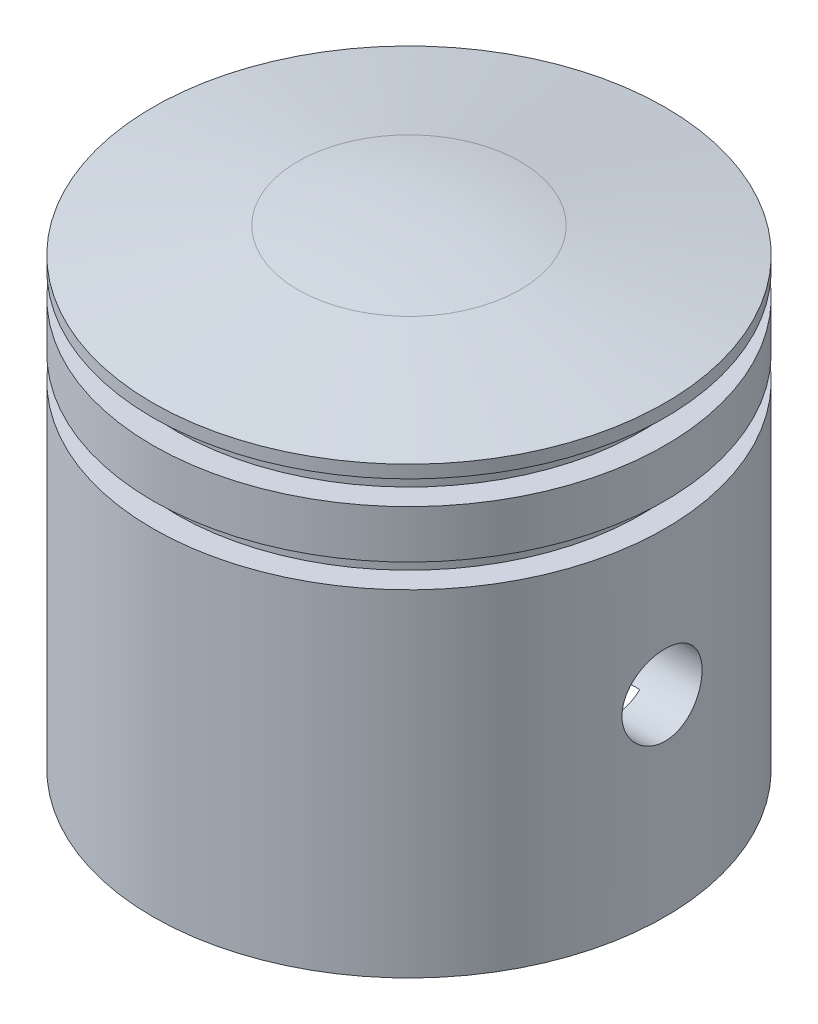
ISO-10303-21;
HEADER;
FILE_DESCRIPTION(('STEP AP214'),'2;1');
FILE_NAME('part.step','',(''),(''),'','','');
FILE_SCHEMA(('AUTOMOTIVE_DESIGN { 1 0 10303 214 1 1 1 1 }'));
ENDSEC;
DATA;
#1=APPLICATION_CONTEXT('core data for automotive mechanical design processes');
#2=APPLICATION_PROTOCOL_DEFINITION('international standard','automotive_design',2000,#1);
#3=PRODUCT_CONTEXT('',#1,'mechanical');
#4=PRODUCT('Part','Part','',(#3));
#5=PRODUCT_RELATED_PRODUCT_CATEGORY('part','',(#4));
#6=PRODUCT_DEFINITION_FORMATION('','',#4);
#7=PRODUCT_DEFINITION_CONTEXT('part definition',#1,'design');
#8=PRODUCT_DEFINITION('design','',#6,#7);
#9=PRODUCT_DEFINITION_SHAPE('','',#8);
#10=(LENGTH_UNIT() NAMED_UNIT(*) SI_UNIT(.MILLI.,.METRE.));
#11=(NAMED_UNIT(*) PLANE_ANGLE_UNIT() SI_UNIT($,.RADIAN.));
#12=(NAMED_UNIT(*) SI_UNIT($,.STERADIAN.) SOLID_ANGLE_UNIT());
#13=UNCERTAINTY_MEASURE_WITH_UNIT(LENGTH_MEASURE(1.E-05),#10,'distance_accuracy_value','');
#14=(GEOMETRIC_REPRESENTATION_CONTEXT(3) GLOBAL_UNCERTAINTY_ASSIGNED_CONTEXT((#13)) GLOBAL_UNIT_ASSIGNED_CONTEXT((#10,
#11,#12)) REPRESENTATION_CONTEXT('',''));
#15=CARTESIAN_POINT('',(0.,0.,0.));
#16=DIRECTION('',(0.,0.,1.));
#17=DIRECTION('',(1.,0.,0.));
#18=AXIS2_PLACEMENT_3D('',#15,#16,#17);
#19=CARTESIAN_POINT('',(0.,10.,0.));
#20=DIRECTION('',(0.,-1.,0.));
#21=DIRECTION('',(0.,0.,-1.));
#22=AXIS2_PLACEMENT_3D('',#19,#20,#21);
#23=PLANE('',#22);
#24=DIRECTION('',(1.,0.,0.));
#25=VECTOR('',#24,1.);
#26=CARTESIAN_POINT('',(-16.,10.,-1.5));
#27=LINE('',#26,#25);
#28=CARTESIAN_POINT('',(-12.913171570145,10.,-1.5));
#29=VERTEX_POINT('',#28);
#30=CARTESIAN_POINT('',(-9.88685996664259,10.,-1.5));
#31=VERTEX_POINT('',#30);
#32=EDGE_CURVE('E75',#29,#31,#27,.T.);
#33=ORIENTED_EDGE('',*,*,#32,.F.);
#34=CARTESIAN_POINT('',(0.,10.,0.));
#35=DIRECTION('',(0.,-1.,0.));
#36=DIRECTION('',(0.,0.,-1.));
#37=AXIS2_PLACEMENT_3D('',#34,#35,#36);
#38=CIRCLE('',#37,13.);
#39=CARTESIAN_POINT('',(12.913171570145,10.,-1.5));
#40=VERTEX_POINT('',#39);
#41=EDGE_CURVE('E262',#29,#40,#38,.T.);
#42=ORIENTED_EDGE('',*,*,#41,.T.);
#43=CARTESIAN_POINT('',(9.88685996664259,10.,-1.5));
#44=VERTEX_POINT('',#43);
#45=EDGE_CURVE('E266',#44,#40,#27,.T.);
#46=ORIENTED_EDGE('',*,*,#45,.F.);
#47=CARTESIAN_POINT('',(0.,10.,0.));
#48=DIRECTION('',(0.,-1.,0.));
#49=DIRECTION('',(0.,0.,-1.));
#50=AXIS2_PLACEMENT_3D('',#47,#48,#49);
#51=CIRCLE('',#50,10.);
#52=EDGE_CURVE('E110',#44,#31,#51,.F.);
#53=ORIENTED_EDGE('',*,*,#52,.T.);
#54=EDGE_LOOP('',(#33,#42,#46,#53));
#55=FACE_BOUND('',#54,.T.);
#56=ADVANCED_FACE('F47',(#55),#23,.T.);
#57=CARTESIAN_POINT('',(0.,30.,0.));
#58=DIRECTION('',(0.,1.,0.));
#59=DIRECTION('',(0.,0.,1.));
#60=AXIS2_PLACEMENT_3D('',#57,#58,#59);
#61=CYLINDRICAL_SURFACE('',#60,16.);
#62=CARTESIAN_POINT('',(0.,27.,0.));
#63=DIRECTION('',(0.,1.,0.));
#64=DIRECTION('',(0.,0.,1.));
#65=AXIS2_PLACEMENT_3D('',#62,#63,#64);
#66=CIRCLE('',#65,16.);
#67=CARTESIAN_POINT('',(0.,27.,16.));
#68=VERTEX_POINT('',#67);
#69=EDGE_CURVE('E237',#68,#68,#66,.T.);
#70=ORIENTED_EDGE('',*,*,#69,.T.);
#71=EDGE_LOOP('',(#70));
#72=FACE_BOUND('',#71,.T.);
#73=CARTESIAN_POINT('',(0.,27.7958327840944,0.));
#74=DIRECTION('',(0.,1.,0.));
#75=DIRECTION('',(0.,0.,1.));
#76=AXIS2_PLACEMENT_3D('',#73,#74,#75);
#77=CIRCLE('',#76,16.);
#78=CARTESIAN_POINT('',(0.,27.7958327840944,16.));
#79=VERTEX_POINT('',#78);
#80=EDGE_CURVE('E248',#79,#79,#77,.T.);
#81=ORIENTED_EDGE('',*,*,#80,.F.);
#82=EDGE_LOOP('',(#81));
#83=FACE_BOUND('',#82,.T.);
#84=ADVANCED_FACE('F160',(#72,#83),#61,.T.);
#85=CARTESIAN_POINT('',(0.,27.7958327840944,0.));
#86=DIRECTION('',(0.,-1.,0.));
#87=DIRECTION('',(0.,0.,-1.));
#88=AXIS2_PLACEMENT_3D('',#85,#86,#87);
#89=CONICAL_SURFACE('',#88,16.,1.39626340159547);
#90=CARTESIAN_POINT('',(0.,29.3923101204884,0.));
#91=DIRECTION('',(0.,1.,0.));
#92=DIRECTION('',(0.,0.,1.));
#93=AXIS2_PLACEMENT_3D('',#90,#91,#92);
#94=CIRCLE('',#93,6.94592710667694);
#95=CARTESIAN_POINT('',(0.,29.3923101204884,6.94592710667694));
#96=VERTEX_POINT('',#95);
#97=EDGE_CURVE('E246',#96,#96,#94,.T.);
#98=ORIENTED_EDGE('',*,*,#97,.F.);
#99=EDGE_LOOP('',(#98));
#100=FACE_BOUND('',#99,.T.);
#101=ORIENTED_EDGE('',*,*,#80,.T.);
#102=EDGE_LOOP('',(#101));
#103=FACE_BOUND('',#102,.T.);
#104=ADVANCED_FACE('F164',(#100,#103),#89,.T.);
#105=CARTESIAN_POINT('',(0.,-10.,0.));
#106=DIRECTION('',(0.,1.,0.));
#107=DIRECTION('',(1.,0.,0.));
#108=AXIS2_PLACEMENT_3D('',#105,#106,#107);
#109=SPHERICAL_SURFACE('',#108,40.);
#110=ORIENTED_EDGE('',*,*,#97,.T.);
#111=EDGE_LOOP('',(#110));
#112=FACE_BOUND('',#111,.T.);
#113=ADVANCED_FACE('F171',(#112),#109,.T.);
#114=CARTESIAN_POINT('',(0.,25.5,-14.5));
#115=DIRECTION('',(0.,-1.,0.));
#116=DIRECTION('',(0.,0.,-1.));
#117=AXIS2_PLACEMENT_3D('',#114,#115,#116);
#118=PLANE('',#117);
#119=CARTESIAN_POINT('',(0.,25.5,0.));
#120=DIRECTION('',(0.,-1.,0.));
#121=DIRECTION('',(0.,0.,-1.));
#122=AXIS2_PLACEMENT_3D('',#119,#120,#121);
#123=CIRCLE('',#122,14.5);
#124=CARTESIAN_POINT('',(0.,25.5,-14.5));
#125=VERTEX_POINT('',#124);
#126=EDGE_CURVE('E234',#125,#125,#123,.T.);
#127=ORIENTED_EDGE('',*,*,#126,.T.);
#128=EDGE_LOOP('',(#127));
#129=FACE_BOUND('',#128,.T.);
#130=CARTESIAN_POINT('',(0.,25.5,0.));
#131=DIRECTION('',(0.,-1.,0.));
#132=DIRECTION('',(0.,0.,-1.));
#133=AXIS2_PLACEMENT_3D('',#130,#131,#132);
#134=CIRCLE('',#133,16.);
#135=CARTESIAN_POINT('',(0.,25.5,-16.));
#136=VERTEX_POINT('',#135);
#137=EDGE_CURVE('E116',#136,#136,#134,.T.);
#138=ORIENTED_EDGE('',*,*,#137,.F.);
#139=EDGE_LOOP('',(#138));
#140=FACE_BOUND('',#139,.T.);
#141=ADVANCED_FACE('F175',(#129,#140),#118,.F.);
#142=CARTESIAN_POINT('',(0.,27.,-14.5));
#143=DIRECTION('',(0.,1.,0.));
#144=DIRECTION('',(0.,0.,1.));
#145=AXIS2_PLACEMENT_3D('',#142,#143,#144);
#146=PLANE('',#145);
#147=CARTESIAN_POINT('',(0.,27.,0.));
#148=DIRECTION('',(0.,-1.,0.));
#149=DIRECTION('',(0.,0.,-1.));
#150=AXIS2_PLACEMENT_3D('',#147,#148,#149);
#151=CIRCLE('',#150,14.5);
#152=CARTESIAN_POINT('',(0.,27.,-14.5));
#153=VERTEX_POINT('',#152);
#154=EDGE_CURVE('E240',#153,#153,#151,.T.);
#155=ORIENTED_EDGE('',*,*,#154,.F.);
#156=EDGE_LOOP('',(#155));
#157=FACE_BOUND('',#156,.T.);
#158=ORIENTED_EDGE('',*,*,#69,.F.);
#159=EDGE_LOOP('',(#158));
#160=FACE_BOUND('',#159,.T.);
#161=ADVANCED_FACE('F192',(#157,#160),#146,.F.);
#162=CARTESIAN_POINT('',(0.,0.,0.));
#163=DIRECTION('',(0.,-1.,0.));
#164=DIRECTION('',(0.,0.,-1.));
#165=AXIS2_PLACEMENT_3D('',#162,#163,#164);
#166=CYLINDRICAL_SURFACE('',#165,14.5);
#167=ORIENTED_EDGE('',*,*,#126,.F.);
#168=EDGE_LOOP('',(#167));
#169=FACE_BOUND('',#168,.T.);
#170=ORIENTED_EDGE('',*,*,#154,.T.);
#171=EDGE_LOOP('',(#170));
#172=FACE_BOUND('',#171,.T.);
#173=ADVANCED_FACE('F189',(#169,#172),#166,.T.);
#174=ORIENTED_EDGE('',*,*,#137,.T.);
#175=EDGE_LOOP('',(#174));
#176=FACE_BOUND('',#175,.T.);
#177=CARTESIAN_POINT('',(0.,22.5,0.));
#178=DIRECTION('',(0.,1.,0.));
#179=DIRECTION('',(0.,0.,1.));
#180=AXIS2_PLACEMENT_3D('',#177,#178,#179);
#181=CIRCLE('',#180,16.);
#182=CARTESIAN_POINT('',(0.,22.5,16.));
#183=VERTEX_POINT('',#182);
#184=EDGE_CURVE('E231',#183,#183,#181,.T.);
#185=ORIENTED_EDGE('',*,*,#184,.T.);
#186=EDGE_LOOP('',(#185));
#187=FACE_BOUND('',#186,.T.);
#188=ADVANCED_FACE('F166',(#176,#187),#61,.T.);
#189=CARTESIAN_POINT('',(0.,21.,-14.5));
#190=DIRECTION('',(0.,-1.,0.));
#191=DIRECTION('',(0.,0.,-1.));
#192=AXIS2_PLACEMENT_3D('',#189,#190,#191);
#193=PLANE('',#192);
#194=CARTESIAN_POINT('',(0.,21.,0.));
#195=DIRECTION('',(0.,-1.,0.));
#196=DIRECTION('',(0.,0.,-1.));
#197=AXIS2_PLACEMENT_3D('',#194,#195,#196);
#198=CIRCLE('',#197,14.5);
#199=CARTESIAN_POINT('',(0.,21.,-14.5));
#200=VERTEX_POINT('',#199);
#201=EDGE_CURVE('E253',#200,#200,#198,.T.);
#202=ORIENTED_EDGE('',*,*,#201,.T.);
#203=EDGE_LOOP('',(#202));
#204=FACE_BOUND('',#203,.T.);
#205=CARTESIAN_POINT('',(0.,21.,0.));
#206=DIRECTION('',(0.,-1.,0.));
#207=DIRECTION('',(0.,0.,-1.));
#208=AXIS2_PLACEMENT_3D('',#205,#206,#207);
#209=CIRCLE('',#208,16.);
#210=CARTESIAN_POINT('',(0.,21.,-16.));
#211=VERTEX_POINT('',#210);
#212=EDGE_CURVE('E233',#211,#211,#209,.T.);
#213=ORIENTED_EDGE('',*,*,#212,.F.);
#214=EDGE_LOOP('',(#213));
#215=FACE_BOUND('',#214,.T.);
#216=ADVANCED_FACE('F182',(#204,#215),#193,.F.);
#217=CARTESIAN_POINT('',(0.,22.5,-14.5));
#218=DIRECTION('',(0.,1.,0.));
#219=DIRECTION('',(0.,0.,1.));
#220=AXIS2_PLACEMENT_3D('',#217,#218,#219);
#221=PLANE('',#220);
#222=CARTESIAN_POINT('',(0.,22.5,0.));
#223=DIRECTION('',(0.,-1.,0.));
#224=DIRECTION('',(0.,0.,-1.));
#225=AXIS2_PLACEMENT_3D('',#222,#223,#224);
#226=CIRCLE('',#225,14.5);
#227=CARTESIAN_POINT('',(0.,22.5,-14.5));
#228=VERTEX_POINT('',#227);
#229=EDGE_CURVE('E113',#228,#228,#226,.T.);
#230=ORIENTED_EDGE('',*,*,#229,.F.);
#231=EDGE_LOOP('',(#230));
#232=FACE_BOUND('',#231,.T.);
#233=ORIENTED_EDGE('',*,*,#184,.F.);
#234=EDGE_LOOP('',(#233));
#235=FACE_BOUND('',#234,.T.);
#236=ADVANCED_FACE('F180',(#232,#235),#221,.F.);
#237=CARTESIAN_POINT('',(0.,0.,0.));
#238=DIRECTION('',(0.,-1.,0.));
#239=DIRECTION('',(0.,0.,-1.));
#240=AXIS2_PLACEMENT_3D('',#237,#238,#239);
#241=CYLINDRICAL_SURFACE('',#240,14.5);
#242=ORIENTED_EDGE('',*,*,#201,.F.);
#243=EDGE_LOOP('',(#242));
#244=FACE_BOUND('',#243,.T.);
#245=ORIENTED_EDGE('',*,*,#229,.T.);
#246=EDGE_LOOP('',(#245));
#247=FACE_BOUND('',#246,.T.);
#248=ADVANCED_FACE('F177',(#244,#247),#241,.T.);
#249=CARTESIAN_POINT('',(0.,0.,0.));
#250=DIRECTION('',(0.,1.,0.));
#251=DIRECTION('',(0.,0.,1.));
#252=AXIS2_PLACEMENT_3D('',#249,#250,#251);
#253=PLANE('',#252);
#254=CARTESIAN_POINT('',(0.,0.,0.));
#255=DIRECTION('',(0.,-1.,0.));
#256=DIRECTION('',(0.,0.,-1.));
#257=AXIS2_PLACEMENT_3D('',#254,#255,#256);
#258=CIRCLE('',#257,13.);
#259=CARTESIAN_POINT('',(0.,0.,-13.));
#260=VERTEX_POINT('',#259);
#261=EDGE_CURVE('E260',#260,#260,#258,.T.);
#262=ORIENTED_EDGE('',*,*,#261,.F.);
#263=EDGE_LOOP('',(#262));
#264=FACE_BOUND('',#263,.T.);
#265=CARTESIAN_POINT('',(0.,0.,0.));
#266=DIRECTION('',(0.,1.,0.));
#267=DIRECTION('',(0.,0.,1.));
#268=AXIS2_PLACEMENT_3D('',#265,#266,#267);
#269=CIRCLE('',#268,16.);
#270=CARTESIAN_POINT('',(0.,0.,16.));
#271=VERTEX_POINT('',#270);
#272=EDGE_CURVE('E99',#271,#271,#269,.T.);
#273=ORIENTED_EDGE('',*,*,#272,.F.);
#274=EDGE_LOOP('',(#273));
#275=FACE_BOUND('',#274,.T.);
#276=ADVANCED_FACE('F49',(#264,#275),#253,.F.);
#277=CARTESIAN_POINT('',(-16.,14.5,0.));
#278=CARTESIAN_POINT('',(-15.9999977019448,14.4999943017285,0.139515097271033));
#279=CARTESIAN_POINT('',(-15.9981561248574,14.4882818862264,0.279109404865704));
#280=CARTESIAN_POINT('',(-15.9909869809759,14.4417563087232,0.554391314978102));
#281=CARTESIAN_POINT('',(-15.9856560884472,14.4069211074965,0.690075061323317));
#282=CARTESIAN_POINT('',(-15.9721069716578,14.3152203371934,0.953512538047404));
#283=CARTESIAN_POINT('',(-15.9638909956317,14.2583719186384,1.0812723522899));
#284=CARTESIAN_POINT('',(-15.9454779403816,14.1243014548584,1.3254212510446));
#285=CARTESIAN_POINT('',(-15.9352811186255,14.0470820569641,1.44181181036831));
#286=CARTESIAN_POINT('',(-15.9139426841436,13.873766951646,1.66091991165162));
#287=CARTESIAN_POINT('',(-15.9027945139234,13.7775330051098,1.76352747914264));
#288=CARTESIAN_POINT('',(-15.8808607613029,13.5692180517311,1.95120768822823));
#289=CARTESIAN_POINT('',(-15.8700752005075,13.4571361026998,2.03627928654192));
#290=CARTESIAN_POINT('',(-15.8500242812745,13.2195617286563,2.18690544328884));
#291=CARTESIAN_POINT('',(-15.840767397861,13.0940005176382,2.25235273557992));
#292=CARTESIAN_POINT('',(-15.8249120174237,12.8334985891422,2.36118681597065));
#293=CARTESIAN_POINT('',(-15.8183133630222,12.6985584274894,2.40457491010063));
#294=CARTESIAN_POINT('',(-15.8085863451104,12.4242890988562,2.46771559322167));
#295=CARTESIAN_POINT('',(-15.8054302653236,12.2850044141812,2.48765705487496));
#296=CARTESIAN_POINT('',(-15.8028617107177,12.0050328111074,2.50392369757622));
#297=CARTESIAN_POINT('',(-15.8034490028802,11.864345980534,2.50025034860466));
#298=CARTESIAN_POINT('',(-15.8082755045521,11.5869029681473,2.4695458080889));
#299=CARTESIAN_POINT('',(-15.8124817218495,11.4501227766469,2.44272562959693));
#300=CARTESIAN_POINT('',(-15.8240205634547,11.1830279936407,2.36681937833752));
#301=CARTESIAN_POINT('',(-15.8313532830641,11.0527135993595,2.31773262684132));
#302=CARTESIAN_POINT('',(-15.8483550685462,10.8016112873228,2.19846916949384));
#303=CARTESIAN_POINT('',(-15.8580339308724,10.6808662082269,2.12820372315549));
#304=CARTESIAN_POINT('',(-15.878630461501,10.4528004643145,1.96864058146637));
#305=CARTESIAN_POINT('',(-15.8895482178821,10.3454807551125,1.87934153253017));
#306=CARTESIAN_POINT('',(-15.911537862489,10.1460897533667,1.68309088822333));
#307=CARTESIAN_POINT('',(-15.9226101363559,10.0541968417305,1.57595800560539));
#308=CARTESIAN_POINT('',(-15.9435512534783,9.8896668543601,1.34769694737936));
#309=CARTESIAN_POINT('',(-15.9534200906202,9.81702987644317,1.22656870068132));
#310=CARTESIAN_POINT('',(-15.9708539902704,9.69306192657761,0.973595927056491));
#311=CARTESIAN_POINT('',(-15.9784174854193,9.641745441467,0.84174418624046));
#312=CARTESIAN_POINT('',(-15.9903756000068,9.56203403255277,0.571149534696759));
#313=CARTESIAN_POINT('',(-15.9947704520898,9.53363742593352,0.4324071306872));
#314=CARTESIAN_POINT('',(-15.9998651172728,9.50081072354981,0.153508336763735));
#315=CARTESIAN_POINT('',(-16.0006027179286,9.49613552102382,0.0133814615087023));
#316=CARTESIAN_POINT('',(-15.9984028649127,9.51023270533598,-0.265654546411642));
#317=CARTESIAN_POINT('',(-15.9954655349964,9.52900430258911,-0.404563719925156));
#318=CARTESIAN_POINT('',(-15.9862692369322,9.58925838768018,-0.676473446265705));
#319=CARTESIAN_POINT('',(-15.9800278421539,9.63062075826773,-0.809501262056042));
#320=CARTESIAN_POINT('',(-15.9649207568356,9.73475509439879,-1.06673406785663));
#321=CARTESIAN_POINT('',(-15.9560549341007,9.79752813844267,-1.19093861303941));
#322=CARTESIAN_POINT('',(-15.9365897274094,9.94327199112658,-1.42807220225041));
#323=CARTESIAN_POINT('',(-15.9259772866342,10.0263974200905,-1.54090512378372));
#324=CARTESIAN_POINT('',(-15.9042388046444,10.2102720859078,-1.75110696507806));
#325=CARTESIAN_POINT('',(-15.8931127309268,10.3110224392049,-1.84847490447018));
#326=CARTESIAN_POINT('',(-15.8714802753665,10.5283811972172,-2.02588080776691));
#327=CARTESIAN_POINT('',(-15.860980411908,10.6451248471223,-2.10575398584126));
#328=CARTESIAN_POINT('',(-15.8419069280583,10.8905160736613,-2.2447556772664));
#329=CARTESIAN_POINT('',(-15.83333325222,11.0191633074895,-2.30388478778105));
#330=CARTESIAN_POINT('',(-15.8191307135236,11.2842296407142,-2.39946771944995));
#331=CARTESIAN_POINT('',(-15.8134908234896,11.4206174687656,-2.43600654947912));
#332=CARTESIAN_POINT('',(-15.8057657028079,11.697689143664,-2.48564122040535));
#333=CARTESIAN_POINT('',(-15.8036802038444,11.838372665419,-2.49873883084997));
#334=CARTESIAN_POINT('',(-15.8033105804488,12.1183987159075,-2.50107452690756));
#335=CARTESIAN_POINT('',(-15.804985160429,12.2577390969335,-2.49057180548425));
#336=CARTESIAN_POINT('',(-15.8118569894183,12.5326452971443,-2.44656223255901));
#337=CARTESIAN_POINT('',(-15.8170542307995,12.6682111245017,-2.41305543086961));
#338=CARTESIAN_POINT('',(-15.8303708885491,12.9316378266405,-2.32408329891852));
#339=CARTESIAN_POINT('',(-15.8384876895341,13.0595054782584,-2.26863761738581));
#340=CARTESIAN_POINT('',(-15.856731840474,13.3041656136763,-2.13738768546417));
#341=CARTESIAN_POINT('',(-15.8668592701083,13.4209576582884,-2.06158262820886));
#342=CARTESIAN_POINT('',(-15.8881156809226,13.6414655441268,-1.8908300813908));
#343=CARTESIAN_POINT('',(-15.8992540116029,13.7450321966138,-1.79569107094768));
#344=CARTESIAN_POINT('',(-15.9212004364073,13.9348212363867,-1.58937594638204));
#345=CARTESIAN_POINT('',(-15.9320084534012,14.0210395985919,-1.47819612078432));
#346=CARTESIAN_POINT('',(-15.952151024567,14.1741512230316,-1.24216685884342));
#347=CARTESIAN_POINT('',(-15.9614763443027,14.2409253727596,-1.11723937214238));
#348=CARTESIAN_POINT('',(-15.9775125983888,14.3524409961929,-0.857851882357786));
#349=CARTESIAN_POINT('',(-15.9842262014212,14.3972049725584,-0.723401776581764));
#350=CARTESIAN_POINT('',(-15.9927744586488,14.4534330210906,-0.490314239911595));
#351=CARTESIAN_POINT('',(-15.9954699162612,14.470868490629,-0.393105575651625));
#352=CARTESIAN_POINT('',(-15.9990834869762,14.4941539133791,-0.197277797850582));
#353=CARTESIAN_POINT('',(-16.0000016250796,14.5000040295573,-0.0986587041691187));
#354=CARTESIAN_POINT('',(-16.,14.5,0.));
#355=B_SPLINE_CURVE_WITH_KNOTS('',3,(#277,#278,#279,#280,#281,#282,#283,#284,#285,#286,#287,
#288,#289,#290,#291,#292,#293,#294,#295,#296,#297,#298,#299,#300,#301,#302,#303,#304,#305,#306,
#307,#308,#309,#310,#311,#312,#313,#314,#315,#316,#317,#318,#319,#320,#321,#322,#323,#324,#325,
#326,#327,#328,#329,#330,#331,#332,#333,#334,#335,#336,#337,#338,#339,#340,#341,#342,#343,#344,
#345,#346,#347,#348,#349,#350,#351,#352,#353,#354),.UNSPECIFIED.,.T.,.F.,(4,2,2,2,2,2,2,2,2,2,2,
2,2,2,2,2,2,2,2,2,2,2,2,2,2,2,2,2,2,2,2,2,2,2,2,2,2,2,4),(0.,0.418184740477491,
0.836768642528014,1.25502707944103,1.6732311879203,2.09459568152199,2.51598523645422,
2.93963778605759,3.36326525009238,3.78345631134994,4.20362121670545,4.6199957602258,
5.03638299651051,5.45453977402348,5.87272629892068,6.29545732334367,6.71819049513827,
7.14121043754565,7.56419931829866,7.98280854005915,8.40140366528357,8.81779444756567,
9.23420620742031,9.65388541469672,10.0735912160142,10.4970948024959,10.9205861964898,
11.3424741039513,11.764330162293,12.1815758159869,12.598820566189,13.0156924696662,
13.4325808967135,13.8538201231554,14.275156971423,14.6990230419984,15.1224548565628,
15.4181801635154,15.7139013105871),.UNSPECIFIED.);
#356=CARTESIAN_POINT('',(-16.,14.5,0.));
#357=VERTEX_POINT('',#356);
#358=EDGE_CURVE('E155',#357,#357,#355,.T.);
#359=ORIENTED_EDGE('',*,*,#358,.T.);
#360=EDGE_LOOP('',(#359));
#361=FACE_BOUND('',#360,.T.);
#362=CARTESIAN_POINT('',(15.8034806292791,12.,-2.5));
#363=CARTESIAN_POINT('',(15.8034830346333,11.860496621659,-2.49999429179104));
#364=CARTESIAN_POINT('',(15.8053478026579,11.7209140023147,-2.48828377742084));
#365=CARTESIAN_POINT('',(15.8125997089632,11.4456563709971,-2.44176643645043));
#366=CARTESIAN_POINT('',(15.8179902148259,11.3099852245206,-2.40693752801736));
#367=CARTESIAN_POINT('',(15.8316684916184,11.0465744103556,-2.31525516047132));
#368=CARTESIAN_POINT('',(15.8399539668268,10.9188285521292,-2.25841914921922));
#369=CARTESIAN_POINT('',(15.8584858981599,10.6747031091579,-2.12437791816389));
#370=CARTESIAN_POINT('',(15.8687321022282,10.5583220663405,-2.04717531605122));
#371=CARTESIAN_POINT('',(15.8901303851737,10.3392035148487,-1.87387730110911));
#372=CARTESIAN_POINT('',(15.9012888784461,10.2365789256004,-1.777639886175));
#373=CARTESIAN_POINT('',(15.9231973082665,10.0488657795701,-1.56931080987672));
#374=CARTESIAN_POINT('',(15.9339472216983,9.96377821377571,-1.45721825316848));
#375=CARTESIAN_POINT('',(15.9538946715316,9.81313512295885,-1.21963429185761));
#376=CARTESIAN_POINT('',(15.9630838016344,9.74768399602554,-1.09407592635729));
#377=CARTESIAN_POINT('',(15.978803149105,9.63884204527492,-0.833580171794756));
#378=CARTESIAN_POINT('',(15.9853335186778,9.59544995861733,-0.698643320136811));
#379=CARTESIAN_POINT('',(15.9949542857973,9.53230128104384,-0.424385325448812));
#380=CARTESIAN_POINT('',(15.9980722260505,9.51235535093165,-0.285108760160752));
#381=CARTESIAN_POINT('',(16.0006113098095,9.49607695669663,-0.00515314355067114));
#382=CARTESIAN_POINT('',(16.0000326754547,9.49974307364815,0.135525822989186));
#383=CARTESIAN_POINT('',(15.9952657389869,9.53043592627786,0.413000089722151));
#384=CARTESIAN_POINT('',(15.9911089169598,9.55725893884032,0.549818542575174));
#385=CARTESIAN_POINT('',(15.9796877395528,9.63318402862262,0.816988375343491));
#386=CARTESIAN_POINT('',(15.9724232987387,9.68228671835413,0.947339577352174));
#387=CARTESIAN_POINT('',(15.9555491842028,9.80158365586005,1.19848742679247));
#388=CARTESIAN_POINT('',(15.9459300777042,9.87186300542795,1.31924299071837));
#389=CARTESIAN_POINT('',(15.9254174702046,10.0314560806292,1.54732385653213));
#390=CARTESIAN_POINT('',(15.9145238783282,10.120771163955,1.65464819959324));
#391=CARTESIAN_POINT('',(15.8925387825556,10.3170334870733,1.85402198520023));
#392=CARTESIAN_POINT('',(15.8814464071021,10.4241586663949,1.94589625613075));
#393=CARTESIAN_POINT('',(15.8604269384475,10.6523975646821,2.11039226047485));
#394=CARTESIAN_POINT('',(15.8504998536298,10.7735113842741,2.18301385538335));
#395=CARTESIAN_POINT('',(15.8329349281613,11.0264796281058,2.30697060635685));
#396=CARTESIAN_POINT('',(15.8252991458489,11.1583435750735,2.35828663884161));
#397=CARTESIAN_POINT('',(15.8132168990948,11.4289648487055,2.43799343127668));
#398=CARTESIAN_POINT('',(15.8087701897074,11.5677216450697,2.46638595195258));
#399=CARTESIAN_POINT('',(15.8036163696886,11.8466281032752,2.49919719237856));
#400=CARTESIAN_POINT('',(15.80287044806,11.9867478001948,2.50386473411271));
#401=CARTESIAN_POINT('',(15.8050994977182,12.2657676352979,2.48975479033184));
#402=CARTESIAN_POINT('',(15.8080743433524,12.4046678145059,2.47097809654328));
#403=CARTESIAN_POINT('',(15.8173740105186,12.6765278074665,2.41072412555896));
#404=CARTESIAN_POINT('',(15.8236803883335,12.8095159986396,2.36937178781979));
#405=CARTESIAN_POINT('',(15.8389172439685,13.0666739711039,2.26527072241932));
#406=CARTESIAN_POINT('',(15.8478478614411,13.190843282649,2.20252085602949));
#407=CARTESIAN_POINT('',(15.8674179220711,13.4279512816488,2.05681199170293));
#408=CARTESIAN_POINT('',(15.8780706945976,13.5407902289,1.97369251093471));
#409=CARTESIAN_POINT('',(15.8998450469621,13.7510069808482,1.78982593995283));
#410=CARTESIAN_POINT('',(15.9109666556111,13.848383833607,1.6890777652142));
#411=CARTESIAN_POINT('',(15.9325473887455,14.0258112706355,1.47171546765808));
#412=CARTESIAN_POINT('',(15.9429995842164,14.1056965764301,1.35496564158984));
#413=CARTESIAN_POINT('',(15.9619548934084,14.2447195199902,1.10955861029337));
#414=CARTESIAN_POINT('',(15.9704580640831,14.3038577640459,0.980901753162492));
#415=CARTESIAN_POINT('',(15.9845269767683,14.3994462752842,0.715839663778327));
#416=CARTESIAN_POINT('',(15.9901042225572,14.4359854974394,0.579467147617089));
#417=CARTESIAN_POINT('',(15.9977412978946,14.4856261326728,0.302427949770746));
#418=CARTESIAN_POINT('',(15.9998013804089,14.498729231356,0.161761577654431));
#419=CARTESIAN_POINT('',(16.0001691012796,14.5010818526552,-0.118272165188271));
#420=CARTESIAN_POINT('',(15.9985164403994,14.4905837446428,-0.257637428859786));
#421=CARTESIAN_POINT('',(15.9917247801431,14.4465746838196,-0.532594595464882));
#422=CARTESIAN_POINT('',(15.9865857947973,14.4130638236216,-0.668186513581641));
#423=CARTESIAN_POINT('',(15.9733964142131,14.3240727402876,-0.931668850429401));
#424=CARTESIAN_POINT('',(15.965348528289,14.2686114484191,-1.05956579651625));
#425=CARTESIAN_POINT('',(15.947223323121,14.137321161478,-1.30427807253219));
#426=CARTESIAN_POINT('',(15.9371459268214,14.0614913930258,-1.42109298145458));
#427=CARTESIAN_POINT('',(15.9159528222148,13.8907105567916,-1.64160219185804));
#428=CARTESIAN_POINT('',(15.9048276353277,13.795573685696,-1.745151694824));
#429=CARTESIAN_POINT('',(15.8828612878644,13.5892700426646,-1.93490712736947));
#430=CARTESIAN_POINT('',(15.8720201944801,13.4780995182753,-2.02110898563013));
#431=CARTESIAN_POINT('',(15.8517779742959,13.2420788957246,-2.17420151541622));
#432=CARTESIAN_POINT('',(15.842386091806,13.1171490413903,-2.24097044145097));
#433=CARTESIAN_POINT('',(15.8262143333515,12.85775678237,-2.35247565604314));
#434=CARTESIAN_POINT('',(15.8194317848938,12.7233042988834,-2.3972345005847));
#435=CARTESIAN_POINT('',(15.8107909670081,12.4902302603036,-2.45344906957713));
#436=CARTESIAN_POINT('',(15.8080643798014,12.3930384000151,-2.47087849275467));
#437=CARTESIAN_POINT('',(15.8044083737681,12.1972442189536,-2.49415589078729));
#438=CARTESIAN_POINT('',(15.8034789284691,12.0986419189782,-2.50000403623692));
#439=CARTESIAN_POINT('',(15.8034806292791,12.,-2.5));
#440=B_SPLINE_CURVE_WITH_KNOTS('',3,(#362,#363,#364,#365,#366,#367,#368,#369,#370,#371,#372,
#373,#374,#375,#376,#377,#378,#379,#380,#381,#382,#383,#384,#385,#386,#387,#388,#389,#390,#391,
#392,#393,#394,#395,#396,#397,#398,#399,#400,#401,#402,#403,#404,#405,#406,#407,#408,#409,#410,
#411,#412,#413,#414,#415,#416,#417,#418,#419,#420,#421,#422,#423,#424,#425,#426,#427,#428,#429,
#430,#431,#432,#433,#434,#435,#436,#437,#438,#439),.UNSPECIFIED.,.T.,.F.,(4,2,2,2,2,2,2,2,2,2,2,
2,2,2,2,2,2,2,2,2,2,2,2,2,2,2,2,2,2,2,2,2,2,2,2,2,2,2,4),(0.,0.418149527902241,
0.836699032574077,1.25491737645053,1.67308199345223,2.09449258051085,2.51592697424482,
2.93956378022295,3.36317633102573,3.78334397517517,4.20348637030326,4.61996979150785,
5.03646466334576,5.45465612930833,5.87287743207563,6.29556043395287,6.71824647655855,
7.14131110038651,7.56434322607052,7.98292940034458,8.40150143908463,8.81778013452042,
9.23408098683358,9.65377352836981,10.0734918986585,10.4970197199928,10.9205351635679,
11.3423727623224,11.7641800198745,12.18149834073,12.5988149821383,13.0157724881518,
13.432745828047,13.8539404040181,14.275233715164,14.6991122166338,15.1225554163993,
15.4182305458031,15.7139013198205),.UNSPECIFIED.);
#441=CARTESIAN_POINT('',(15.8034806292791,12.,-2.5));
#442=VERTEX_POINT('',#441);
#443=EDGE_CURVE('E150',#442,#442,#440,.T.);
#444=ORIENTED_EDGE('',*,*,#443,.T.);
#445=EDGE_LOOP('',(#444));
#446=FACE_BOUND('',#445,.T.);
#447=ORIENTED_EDGE('',*,*,#212,.T.);
#448=EDGE_LOOP('',(#447));
#449=FACE_BOUND('',#448,.T.);
#450=ORIENTED_EDGE('',*,*,#272,.T.);
#451=EDGE_LOOP('',(#450));
#452=FACE_BOUND('',#451,.T.);
#453=ADVANCED_FACE('F167',(#361,#446,#449,#452),#61,.T.);
#454=DIRECTION('',(1.,0.,0.));
#455=VECTOR('',#454,1.);
#456=CARTESIAN_POINT('',(-16.,10.,1.5));
#457=LINE('',#456,#455);
#458=CARTESIAN_POINT('',(12.913171570145,10.,1.5));
#459=VERTEX_POINT('',#458);
#460=CARTESIAN_POINT('',(9.88685996664259,10.,1.5));
#461=VERTEX_POINT('',#460);
#462=EDGE_CURVE('E68',#459,#461,#457,.F.);
#463=ORIENTED_EDGE('',*,*,#462,.F.);
#464=CARTESIAN_POINT('',(-12.913171570145,10.,1.5));
#465=VERTEX_POINT('',#464);
#466=EDGE_CURVE('E106',#459,#465,#38,.T.);
#467=ORIENTED_EDGE('',*,*,#466,.T.);
#468=CARTESIAN_POINT('',(-9.88685996664259,10.,1.5));
#469=VERTEX_POINT('',#468);
#470=EDGE_CURVE('E93',#469,#465,#457,.F.);
#471=ORIENTED_EDGE('',*,*,#470,.F.);
#472=EDGE_CURVE('E104',#469,#461,#51,.F.);
#473=ORIENTED_EDGE('',*,*,#472,.T.);
#474=EDGE_LOOP('',(#463,#467,#471,#473));
#475=FACE_BOUND('',#474,.T.);
#476=ADVANCED_FACE('F103',(#475),#23,.T.);
#477=CARTESIAN_POINT('',(0.,10.,0.));
#478=DIRECTION('',(0.,-1.,0.));
#479=DIRECTION('',(0.,0.,-1.));
#480=AXIS2_PLACEMENT_3D('',#477,#478,#479);
#481=CYLINDRICAL_SURFACE('',#480,13.);
#482=ORIENTED_EDGE('',*,*,#41,.F.);
#483=CARTESIAN_POINT('',(-12.913171570145,10.,-1.5));
#484=CARTESIAN_POINT('',(-12.9196464939997,9.95820085358915,-1.44426579878659));
#485=CARTESIAN_POINT('',(-12.9259549192278,9.91874092086907,-1.38679796540747));
#486=CARTESIAN_POINT('',(-12.9380773902685,9.84473133764257,-1.26873073828123));
#487=CARTESIAN_POINT('',(-12.9438914163828,9.81018188274731,-1.20813121991303));
#488=CARTESIAN_POINT('',(-12.9603404608392,9.71430178140072,-1.02224257355282));
#489=CARTESIAN_POINT('',(-12.9699930765876,9.66067330241013,-0.892775127826518));
#490=CARTESIAN_POINT('',(-12.9855839172602,9.57571702553779,-0.626442746105629));
#491=CARTESIAN_POINT('',(-12.9915189085937,9.54440863841842,-0.489571482352221));
#492=CARTESIAN_POINT('',(-12.9990013032835,9.50512260914373,-0.212467802603064));
#493=CARTESIAN_POINT('',(-13.0005515461425,9.49712986799228,-0.0722376211678123));
#494=CARTESIAN_POINT('',(-12.9991042541622,9.50466026890764,0.206029683769606));
#495=CARTESIAN_POINT('',(-12.996155887224,9.51992916830979,0.344074092382287));
#496=CARTESIAN_POINT('',(-12.986125153176,9.57304239783094,0.615650842540818));
#497=CARTESIAN_POINT('',(-12.9790411747057,9.61089552758196,0.749181403888349));
#498=CARTESIAN_POINT('',(-12.9627490398878,9.70119099514041,0.989738928879762));
#499=CARTESIAN_POINT('',(-12.9539797808047,9.75083257474323,1.09785208331175));
#500=CARTESIAN_POINT('',(-12.9395107443663,9.83627154609569,1.25371177293855));
#501=CARTESIAN_POINT('',(-12.9344702910731,9.86656964555138,1.30459866498264));
#502=CARTESIAN_POINT('',(-12.9240502172861,9.9306832908871,1.4040757561164));
#503=CARTESIAN_POINT('',(-12.9186705698196,9.96449911663509,1.45266577202019));
#504=CARTESIAN_POINT('',(-12.913171570145,10.,1.5));
#505=B_SPLINE_CURVE_WITH_KNOTS('',3,(#483,#484,#485,#486,#487,#488,#489,#490,#491,#492,#493,
#494,#495,#496,#497,#498,#499,#500,#501,#502,#503,#504),.UNSPECIFIED.,.F.,.F.,(4,2,2,2,2,2,2,2,
2,2,4),(0.,0.209776062140149,0.419560478466375,0.838801230764256,1.25840613426738,
1.67773924513587,2.09252194041192,2.50746635565219,2.86404950501363,3.04223164009906,
3.22042796209395),.UNSPECIFIED.);
#506=EDGE_CURVE('E137',#29,#465,#505,.T.);
#507=ORIENTED_EDGE('',*,*,#506,.T.);
#508=ORIENTED_EDGE('',*,*,#466,.F.);
#509=CARTESIAN_POINT('',(12.913171570145,10.,1.5));
#510=CARTESIAN_POINT('',(12.9196464939997,9.95820085358915,1.44426579878659));
#511=CARTESIAN_POINT('',(12.9259549192278,9.91874092086907,1.38679796540747));
#512=CARTESIAN_POINT('',(12.9380773902685,9.84473133764257,1.26873073828123));
#513=CARTESIAN_POINT('',(12.9438914163828,9.81018188274731,1.20813121991303));
#514=CARTESIAN_POINT('',(12.9603404608392,9.71430178140072,1.02224257355282));
#515=CARTESIAN_POINT('',(12.9699930765876,9.66067330241013,0.892775127826518));
#516=CARTESIAN_POINT('',(12.9855839172602,9.57571702553779,0.626442746105629));
#517=CARTESIAN_POINT('',(12.9915189085937,9.54440863841842,0.489571482352221));
#518=CARTESIAN_POINT('',(12.9990013032835,9.50512260914373,0.212467802603064));
#519=CARTESIAN_POINT('',(13.0005515461425,9.49712986799228,0.0722376211678123));
#520=CARTESIAN_POINT('',(12.9991042541622,9.50466026890764,-0.206029683769606));
#521=CARTESIAN_POINT('',(12.996155887224,9.51992916830979,-0.344074092382287));
#522=CARTESIAN_POINT('',(12.986125153176,9.57304239783094,-0.615650842540818));
#523=CARTESIAN_POINT('',(12.9790411747057,9.61089552758196,-0.749181403888349));
#524=CARTESIAN_POINT('',(12.9627490398878,9.70119099514041,-0.989738928879762));
#525=CARTESIAN_POINT('',(12.9539797808047,9.75083257474323,-1.09785208331175));
#526=CARTESIAN_POINT('',(12.9395107443663,9.83627154609569,-1.25371177293855));
#527=CARTESIAN_POINT('',(12.9344702910731,9.86656964555138,-1.30459866498264));
#528=CARTESIAN_POINT('',(12.9240502172861,9.9306832908871,-1.4040757561164));
#529=CARTESIAN_POINT('',(12.9186705698196,9.96449911663509,-1.45266577202019));
#530=CARTESIAN_POINT('',(12.913171570145,10.,-1.5));
#531=B_SPLINE_CURVE_WITH_KNOTS('',3,(#509,#510,#511,#512,#513,#514,#515,#516,#517,#518,#519,
#520,#521,#522,#523,#524,#525,#526,#527,#528,#529,#530),.UNSPECIFIED.,.F.,.F.,(4,2,2,2,2,2,2,2,
2,2,4),(0.,0.209776062140149,0.419560478466375,0.838801230764256,1.25840613426738,
1.67773924513587,2.09252194041192,2.50746635565219,2.86404950501363,3.04223164009906,
3.22042796209395),.UNSPECIFIED.);
#532=EDGE_CURVE('E144',#459,#40,#531,.T.);
#533=ORIENTED_EDGE('',*,*,#532,.T.);
#534=EDGE_LOOP('',(#482,#507,#508,#533));
#535=FACE_BOUND('',#534,.T.);
#536=ORIENTED_EDGE('',*,*,#261,.T.);
#537=EDGE_LOOP('',(#536));
#538=FACE_BOUND('',#537,.T.);
#539=ADVANCED_FACE('F209',(#535,#538),#481,.F.);
#540=CARTESIAN_POINT('',(0.,24.,0.));
#541=DIRECTION('',(0.,-1.,0.));
#542=DIRECTION('',(0.,0.,-1.));
#543=AXIS2_PLACEMENT_3D('',#540,#541,#542);
#544=PLANE('',#543);
#545=CARTESIAN_POINT('',(0.,24.,0.));
#546=DIRECTION('',(0.,-1.,0.));
#547=DIRECTION('',(0.,0.,-1.));
#548=AXIS2_PLACEMENT_3D('',#545,#546,#547);
#549=CIRCLE('',#548,10.);
#550=CARTESIAN_POINT('',(0.,24.,-10.));
#551=VERTEX_POINT('',#550);
#552=EDGE_CURVE('E109',#551,#551,#549,.T.);
#553=ORIENTED_EDGE('',*,*,#552,.T.);
#554=EDGE_LOOP('',(#553));
#555=FACE_BOUND('',#554,.T.);
#556=ADVANCED_FACE('F213',(#555),#544,.T.);
#557=CARTESIAN_POINT('',(0.,24.,0.));
#558=DIRECTION('',(0.,-1.,0.));
#559=DIRECTION('',(0.,0.,-1.));
#560=AXIS2_PLACEMENT_3D('',#557,#558,#559);
#561=CYLINDRICAL_SURFACE('',#560,10.);
#562=ORIENTED_EDGE('',*,*,#552,.F.);
#563=EDGE_LOOP('',(#562));
#564=FACE_BOUND('',#563,.T.);
#565=ORIENTED_EDGE('',*,*,#52,.F.);
#566=CARTESIAN_POINT('',(9.88685996664259,10.,-1.5));
#567=CARTESIAN_POINT('',(9.87829702632978,10.0423381044855,-1.55644775774642));
#568=CARTESIAN_POINT('',(9.8695164098382,10.0870272455987,-1.61105469283506));
#569=CARTESIAN_POINT('',(9.85176215376839,10.1808382203519,-1.71628235343695));
#570=CARTESIAN_POINT('',(9.84278851814074,10.2299599633339,-1.76690316043694));
#571=CARTESIAN_POINT('',(9.8159502550057,10.3835199248386,-1.91228287155091));
#572=CARTESIAN_POINT('',(9.79815893076327,10.4941971430423,-2.00061796766923));
#573=CARTESIAN_POINT('',(9.76481433608198,10.7291280421412,-2.15751587055995));
#574=CARTESIAN_POINT('',(9.74926267017561,10.8533913453404,-2.22606453693198));
#575=CARTESIAN_POINT('',(9.72224025261607,11.1120506879739,-2.34127318968291));
#576=CARTESIAN_POINT('',(9.7107671007491,11.246440711182,-2.38794605518357));
#577=CARTESIAN_POINT('',(9.6934351616116,11.5194319951237,-2.45735418339059));
#578=CARTESIAN_POINT('',(9.6874935617474,11.6579379985205,-2.48044304897375));
#579=CARTESIAN_POINT('',(9.68165898643259,11.937005984586,-2.50312290551809));
#580=CARTESIAN_POINT('',(9.68176622057743,12.0775680383293,-2.50271308223672));
#581=CARTESIAN_POINT('',(9.68793593914431,12.3529816746888,-2.47871632829885));
#582=CARTESIAN_POINT('',(9.69384866853871,12.4878879868879,-2.45571222118534));
#583=CARTESIAN_POINT('',(9.71071117534564,12.7518469398539,-2.38815579017542));
#584=CARTESIAN_POINT('',(9.72166092471398,12.8808996132072,-2.34360358625042));
#585=CARTESIAN_POINT('',(9.74746560596719,13.1307885670213,-2.23385335557449));
#586=CARTESIAN_POINT('',(9.7623529195144,13.2515457436194,-2.16848317197037));
#587=CARTESIAN_POINT('',(9.79434578612789,13.4805714327983,-2.01906213967446));
#588=CARTESIAN_POINT('',(9.81145177041249,13.5888375098736,-1.93500765725064));
#589=CARTESIAN_POINT('',(9.84655716119831,13.7930738176455,-1.74774822886379));
#590=CARTESIAN_POINT('',(9.86456812118589,13.8886024628581,-1.64406327335133));
#591=CARTESIAN_POINT('',(9.89902179366731,14.0610160403167,-1.42196244073076));
#592=CARTESIAN_POINT('',(9.91546444768792,14.1379002775831,-1.30354601474861));
#593=CARTESIAN_POINT('',(9.94504061645413,14.2711428922548,-1.05449104713443));
#594=CARTESIAN_POINT('',(9.95815689068242,14.3273949788563,-0.923793454785755));
#595=CARTESIAN_POINT('',(9.97947886085677,14.4170037555349,-0.654395587270723));
#596=CARTESIAN_POINT('',(9.98768547304251,14.4503647177176,-0.515696810583525));
#597=CARTESIAN_POINT('',(9.99811008554861,14.492511399187,-0.237953144489439));
#598=CARTESIAN_POINT('',(10.000472783337,14.5018911060145,-0.0990037399750364));
#599=CARTESIAN_POINT('',(9.99936924845989,14.4974769837093,0.178494017362685));
#600=CARTESIAN_POINT('',(9.9959035931882,14.4836854500677,0.317042408550894));
#601=CARTESIAN_POINT('',(9.98363158834437,14.4338166174374,0.587489627768107));
#602=CARTESIAN_POINT('',(9.97491213094045,14.398101730266,0.719459604109864));
#603=CARTESIAN_POINT('',(9.95313476079063,14.3058384175761,0.975517412390961));
#604=CARTESIAN_POINT('',(9.94007644385454,14.2492880510571,1.09960450871051));
#605=CARTESIAN_POINT('',(9.91073923754746,14.1159019692027,1.33865740980875));
#606=CARTESIAN_POINT('',(9.89441061986185,14.0387459906073,1.45343824787646));
#607=CARTESIAN_POINT('',(9.86040263626624,13.8667177176332,1.66863689951077));
#608=CARTESIAN_POINT('',(9.84272302915515,13.7718422552908,1.76905213905724));
#609=CARTESIAN_POINT('',(9.80745084022131,13.5642240624884,1.95528314890227));
#610=CARTESIAN_POINT('',(9.78987165809029,13.4510916023801,2.04066765914235));
#611=CARTESIAN_POINT('',(9.75727211093037,13.2117695504121,2.19125512858105));
#612=CARTESIAN_POINT('',(9.7422516273326,13.0855805640214,2.25645902305417));
#613=CARTESIAN_POINT('',(9.71660606378031,12.8241689441377,2.36445617235024));
#614=CARTESIAN_POINT('',(9.70596195913239,12.6889884439287,2.40734664724386));
#615=CARTESIAN_POINT('',(9.690285382318,12.4130147047863,2.4697005191477));
#616=CARTESIAN_POINT('',(9.68525196910656,12.272222411187,2.48916784481465));
#617=CARTESIAN_POINT('',(9.681485324806,11.993351206597,2.50377586091762));
#618=CARTESIAN_POINT('',(9.68257592473742,11.855309944987,2.49959675920337));
#619=CARTESIAN_POINT('',(9.69051463097382,11.5819844112358,2.46863857730251));
#620=CARTESIAN_POINT('',(9.69736172755085,11.4466996598465,2.44186346060474));
#621=CARTESIAN_POINT('',(9.7159273203141,11.1837046528562,2.36690028143319));
#622=CARTESIAN_POINT('',(9.7276078655847,11.0559440558689,2.31887884039046));
#623=CARTESIAN_POINT('',(9.75452243524015,10.8101859662753,2.20291272179486));
#624=CARTESIAN_POINT('',(9.76975797816177,10.692192675089,2.13495952708639));
#625=CARTESIAN_POINT('',(9.80205872758479,10.4694963184945,1.98134844584284));
#626=CARTESIAN_POINT('',(9.81911397671682,10.3647271454983,1.89578474961086));
#627=CARTESIAN_POINT('',(9.8447745214587,10.2190217365953,1.755753626632));
#628=CARTESIAN_POINT('',(9.85334316782526,10.172350926578,1.70711514965063));
#629=CARTESIAN_POINT('',(9.870294132368,10.0830705460944,1.60621122310691));
#630=CARTESIAN_POINT('',(9.87867644573856,10.0404610802791,1.5539456801438));
#631=CARTESIAN_POINT('',(9.88685996664259,10.,1.5));
#632=B_SPLINE_CURVE_WITH_KNOTS('',3,(#566,#567,#568,#569,#570,#571,#572,#573,#574,#575,#576,
#577,#578,#579,#580,#581,#582,#583,#584,#585,#586,#587,#588,#589,#590,#591,#592,#593,#594,#595,
#596,#597,#598,#599,#600,#601,#602,#603,#604,#605,#606,#607,#608,#609,#610,#611,#612,#613,#614,
#615,#616,#617,#618,#619,#620,#621,#622,#623,#624,#625,#626,#627,#628,#629,#630,#631),
.UNSPECIFIED.,.F.,.F.,(4,2,2,2,2,2,2,2,2,2,2,2,2,2,2,2,2,2,2,2,2,2,2,2,2,2,2,2,2,2,2,2,4),(0.,
0.213103721326465,0.426203085131623,0.852181800832106,1.27846419335663,1.70449530088862,
2.12404062076729,2.5436004781318,2.95261455314387,3.36162635095093,3.77411240988667,
4.18667875961763,4.61107499679723,5.03548705112688,5.46205582242953,5.88854496274304,
6.30436336451694,6.72014057509215,7.12922311238162,7.53834376879667,7.95423603916423,
8.37020273579977,8.7966430274964,9.22306355277567,9.64761025686135,10.072085743757,
10.4844141078325,10.8966701618447,11.3057489306138,11.7150027605523,12.1221220591718,
12.3257851941602,12.5294535756357),.UNSPECIFIED.);
#633=EDGE_CURVE('E11',#44,#461,#632,.T.);
#634=ORIENTED_EDGE('',*,*,#633,.T.);
#635=ORIENTED_EDGE('',*,*,#472,.F.);
#636=CARTESIAN_POINT('',(-9.88685996664259,10.,1.5));
#637=CARTESIAN_POINT('',(-9.87829702632978,10.0423381044855,1.55644775774642));
#638=CARTESIAN_POINT('',(-9.8695164098382,10.0870272455987,1.61105469283506));
#639=CARTESIAN_POINT('',(-9.85176215376839,10.1808382203519,1.71628235343695));
#640=CARTESIAN_POINT('',(-9.84278851814074,10.2299599633339,1.76690316043694));
#641=CARTESIAN_POINT('',(-9.8159502550057,10.3835199248386,1.91228287155091));
#642=CARTESIAN_POINT('',(-9.79815893076327,10.4941971430423,2.00061796766923));
#643=CARTESIAN_POINT('',(-9.76481433608198,10.7291280421412,2.15751587055995));
#644=CARTESIAN_POINT('',(-9.74926267017561,10.8533913453404,2.22606453693198));
#645=CARTESIAN_POINT('',(-9.72224025261607,11.1120506879739,2.34127318968291));
#646=CARTESIAN_POINT('',(-9.7107671007491,11.246440711182,2.38794605518357));
#647=CARTESIAN_POINT('',(-9.6934351616116,11.5194319951237,2.45735418339059));
#648=CARTESIAN_POINT('',(-9.6874935617474,11.6579379985205,2.48044304897375));
#649=CARTESIAN_POINT('',(-9.68165898643259,11.937005984586,2.50312290551809));
#650=CARTESIAN_POINT('',(-9.68176622057743,12.0775680383293,2.50271308223672));
#651=CARTESIAN_POINT('',(-9.68793593914431,12.3529816746888,2.47871632829885));
#652=CARTESIAN_POINT('',(-9.69384866853871,12.4878879868879,2.45571222118534));
#653=CARTESIAN_POINT('',(-9.71071117534564,12.7518469398539,2.38815579017542));
#654=CARTESIAN_POINT('',(-9.72166092471398,12.8808996132072,2.34360358625042));
#655=CARTESIAN_POINT('',(-9.74746560596719,13.1307885670213,2.23385335557449));
#656=CARTESIAN_POINT('',(-9.7623529195144,13.2515457436194,2.16848317197037));
#657=CARTESIAN_POINT('',(-9.79434578612789,13.4805714327983,2.01906213967446));
#658=CARTESIAN_POINT('',(-9.81145177041249,13.5888375098736,1.93500765725064));
#659=CARTESIAN_POINT('',(-9.84655716119831,13.7930738176455,1.74774822886379));
#660=CARTESIAN_POINT('',(-9.86456812118589,13.8886024628581,1.64406327335133));
#661=CARTESIAN_POINT('',(-9.89902179366731,14.0610160403167,1.42196244073076));
#662=CARTESIAN_POINT('',(-9.91546444768792,14.1379002775831,1.30354601474861));
#663=CARTESIAN_POINT('',(-9.94504061645413,14.2711428922548,1.05449104713443));
#664=CARTESIAN_POINT('',(-9.95815689068242,14.3273949788563,0.923793454785755));
#665=CARTESIAN_POINT('',(-9.97947886085677,14.4170037555349,0.654395587270723));
#666=CARTESIAN_POINT('',(-9.98768547304251,14.4503647177176,0.515696810583525));
#667=CARTESIAN_POINT('',(-9.99811008554861,14.492511399187,0.237953144489439));
#668=CARTESIAN_POINT('',(-10.000472783337,14.5018911060145,0.0990037399750364));
#669=CARTESIAN_POINT('',(-9.99936924845989,14.4974769837093,-0.178494017362685));
#670=CARTESIAN_POINT('',(-9.9959035931882,14.4836854500677,-0.317042408550894));
#671=CARTESIAN_POINT('',(-9.98363158834437,14.4338166174374,-0.587489627768107));
#672=CARTESIAN_POINT('',(-9.97491213094045,14.398101730266,-0.719459604109864));
#673=CARTESIAN_POINT('',(-9.95313476079063,14.3058384175761,-0.975517412390961));
#674=CARTESIAN_POINT('',(-9.94007644385454,14.2492880510571,-1.09960450871051));
#675=CARTESIAN_POINT('',(-9.91073923754746,14.1159019692027,-1.33865740980875));
#676=CARTESIAN_POINT('',(-9.89441061986185,14.0387459906073,-1.45343824787646));
#677=CARTESIAN_POINT('',(-9.86040263626624,13.8667177176332,-1.66863689951077));
#678=CARTESIAN_POINT('',(-9.84272302915515,13.7718422552908,-1.76905213905724));
#679=CARTESIAN_POINT('',(-9.80745084022131,13.5642240624884,-1.95528314890227));
#680=CARTESIAN_POINT('',(-9.78987165809029,13.4510916023801,-2.04066765914235));
#681=CARTESIAN_POINT('',(-9.75727211093037,13.2117695504121,-2.19125512858105));
#682=CARTESIAN_POINT('',(-9.7422516273326,13.0855805640214,-2.25645902305417));
#683=CARTESIAN_POINT('',(-9.71660606378031,12.8241689441377,-2.36445617235024));
#684=CARTESIAN_POINT('',(-9.70596195913239,12.6889884439287,-2.40734664724386));
#685=CARTESIAN_POINT('',(-9.690285382318,12.4130147047863,-2.4697005191477));
#686=CARTESIAN_POINT('',(-9.68525196910656,12.272222411187,-2.48916784481465));
#687=CARTESIAN_POINT('',(-9.681485324806,11.993351206597,-2.50377586091762));
#688=CARTESIAN_POINT('',(-9.68257592473742,11.855309944987,-2.49959675920337));
#689=CARTESIAN_POINT('',(-9.69051463097382,11.5819844112358,-2.46863857730251));
#690=CARTESIAN_POINT('',(-9.69736172755085,11.4466996598465,-2.44186346060474));
#691=CARTESIAN_POINT('',(-9.7159273203141,11.1837046528562,-2.36690028143319));
#692=CARTESIAN_POINT('',(-9.7276078655847,11.0559440558689,-2.31887884039046));
#693=CARTESIAN_POINT('',(-9.75452243524015,10.8101859662753,-2.20291272179486));
#694=CARTESIAN_POINT('',(-9.76975797816177,10.692192675089,-2.13495952708639));
#695=CARTESIAN_POINT('',(-9.80205872758479,10.4694963184945,-1.98134844584284));
#696=CARTESIAN_POINT('',(-9.81911397671682,10.3647271454983,-1.89578474961086));
#697=CARTESIAN_POINT('',(-9.8447745214587,10.2190217365953,-1.755753626632));
#698=CARTESIAN_POINT('',(-9.85334316782526,10.172350926578,-1.70711514965063));
#699=CARTESIAN_POINT('',(-9.870294132368,10.0830705460944,-1.60621122310691));
#700=CARTESIAN_POINT('',(-9.87867644573856,10.0404610802791,-1.5539456801438));
#701=CARTESIAN_POINT('',(-9.88685996664259,10.,-1.5));
#702=B_SPLINE_CURVE_WITH_KNOTS('',3,(#636,#637,#638,#639,#640,#641,#642,#643,#644,#645,#646,
#647,#648,#649,#650,#651,#652,#653,#654,#655,#656,#657,#658,#659,#660,#661,#662,#663,#664,#665,
#666,#667,#668,#669,#670,#671,#672,#673,#674,#675,#676,#677,#678,#679,#680,#681,#682,#683,#684,
#685,#686,#687,#688,#689,#690,#691,#692,#693,#694,#695,#696,#697,#698,#699,#700,#701),
.UNSPECIFIED.,.F.,.F.,(4,2,2,2,2,2,2,2,2,2,2,2,2,2,2,2,2,2,2,2,2,2,2,2,2,2,2,2,2,2,2,2,4),(0.,
0.213103721326465,0.426203085131623,0.852181800832106,1.27846419335663,1.70449530088862,
2.12404062076729,2.5436004781318,2.95261455314387,3.36162635095093,3.77411240988667,
4.18667875961763,4.61107499679723,5.03548705112688,5.46205582242953,5.88854496274304,
6.30436336451694,6.72014057509215,7.12922311238162,7.53834376879667,7.95423603916423,
8.37020273579977,8.7966430274964,9.22306355277567,9.64761025686135,10.072085743757,
10.4844141078325,10.8966701618447,11.3057489306138,11.7150027605523,12.1221220591718,
12.3257851941602,12.5294535756357),.UNSPECIFIED.);
#703=EDGE_CURVE('E61',#469,#31,#702,.T.);
#704=ORIENTED_EDGE('',*,*,#703,.T.);
#705=EDGE_LOOP('',(#565,#634,#635,#704));
#706=FACE_BOUND('',#705,.T.);
#707=ADVANCED_FACE('F108',(#564,#706),#561,.F.);
#708=CARTESIAN_POINT('',(-16.,12.,0.));
#709=DIRECTION('',(1.,0.,0.));
#710=DIRECTION('',(0.,0.,-1.));
#711=AXIS2_PLACEMENT_3D('',#708,#709,#710);
#712=CYLINDRICAL_SURFACE('',#711,2.5);
#713=ORIENTED_EDGE('',*,*,#32,.T.);
#714=ORIENTED_EDGE('',*,*,#703,.F.);
#715=ORIENTED_EDGE('',*,*,#470,.T.);
#716=ORIENTED_EDGE('',*,*,#506,.F.);
#717=EDGE_LOOP('',(#713,#714,#715,#716));
#718=FACE_BOUND('',#717,.T.);
#719=ORIENTED_EDGE('',*,*,#358,.F.);
#720=EDGE_LOOP('',(#719));
#721=FACE_BOUND('',#720,.T.);
#722=ADVANCED_FACE('F91',(#718,#721),#712,.F.);
#723=ORIENTED_EDGE('',*,*,#462,.T.);
#724=ORIENTED_EDGE('',*,*,#633,.F.);
#725=ORIENTED_EDGE('',*,*,#45,.T.);
#726=ORIENTED_EDGE('',*,*,#532,.F.);
#727=EDGE_LOOP('',(#723,#724,#725,#726));
#728=FACE_BOUND('',#727,.T.);
#729=ORIENTED_EDGE('',*,*,#443,.F.);
#730=EDGE_LOOP('',(#729));
#731=FACE_BOUND('',#730,.T.);
#732=ADVANCED_FACE('F128',(#728,#731),#712,.F.);
#733=CLOSED_SHELL('',(#56,#84,#104,#113,#141,#161,#173,#188,#216,#236,#248,#276,#453,#476,#539,
#556,#707,#722,#732));
#734=MANIFOLD_SOLID_BREP('B2',#733);
#735=ADVANCED_BREP_SHAPE_REPRESENTATION('',(#18,#734),#14);
#736=SHAPE_DEFINITION_REPRESENTATION(#9,#735);
ENDSEC;
END-ISO-10303-21;
